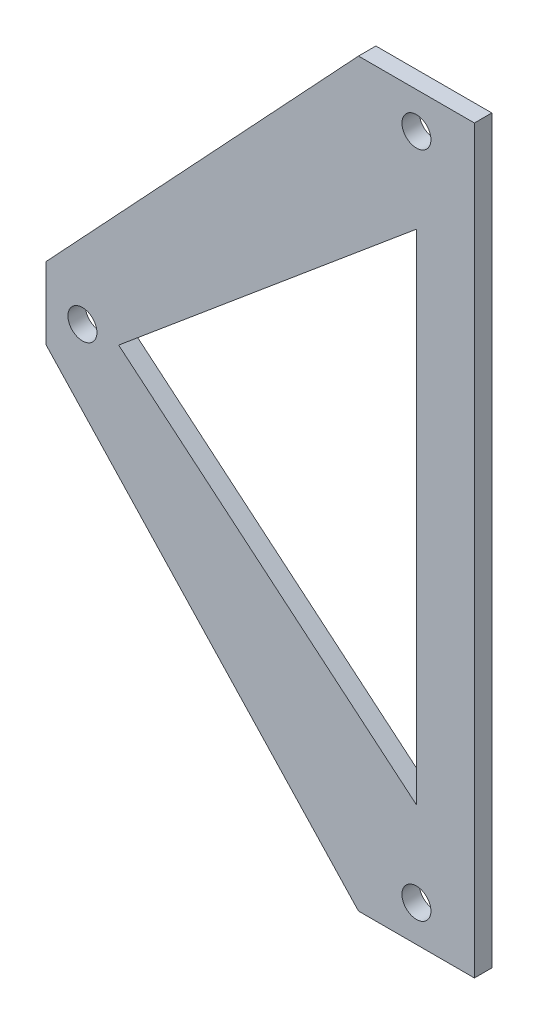
ISO-10303-21;
HEADER;
FILE_DESCRIPTION(('STEP AP214'),'2;1');
FILE_NAME('part.step','',(''),(''),'','','');
FILE_SCHEMA(('AUTOMOTIVE_DESIGN { 1 0 10303 214 1 1 1 1 }'));
ENDSEC;
DATA;
#1=APPLICATION_CONTEXT('core data for automotive mechanical design processes');
#2=APPLICATION_PROTOCOL_DEFINITION('international standard','automotive_design',2000,#1);
#3=PRODUCT_CONTEXT('',#1,'mechanical');
#4=PRODUCT('Part','Part','',(#3));
#5=PRODUCT_RELATED_PRODUCT_CATEGORY('part','',(#4));
#6=PRODUCT_DEFINITION_FORMATION('','',#4);
#7=PRODUCT_DEFINITION_CONTEXT('part definition',#1,'design');
#8=PRODUCT_DEFINITION('design','',#6,#7);
#9=PRODUCT_DEFINITION_SHAPE('','',#8);
#10=(LENGTH_UNIT() NAMED_UNIT(*) SI_UNIT(.MILLI.,.METRE.));
#11=(NAMED_UNIT(*) PLANE_ANGLE_UNIT() SI_UNIT($,.RADIAN.));
#12=(NAMED_UNIT(*) SI_UNIT($,.STERADIAN.) SOLID_ANGLE_UNIT());
#13=UNCERTAINTY_MEASURE_WITH_UNIT(LENGTH_MEASURE(1.E-05),#10,'distance_accuracy_value','');
#14=(GEOMETRIC_REPRESENTATION_CONTEXT(3) GLOBAL_UNCERTAINTY_ASSIGNED_CONTEXT((#13)) GLOBAL_UNIT_ASSIGNED_CONTEXT((#10,
#11,#12)) REPRESENTATION_CONTEXT('',''));
#15=CARTESIAN_POINT('',(0.,0.,0.));
#16=DIRECTION('',(0.,0.,1.));
#17=DIRECTION('',(1.,0.,0.));
#18=AXIS2_PLACEMENT_3D('',#15,#16,#17);
#19=CARTESIAN_POINT('',(0.,0.,1.2));
#20=DIRECTION('',(0.,0.,1.));
#21=DIRECTION('',(1.,0.,0.));
#22=AXIS2_PLACEMENT_3D('',#19,#20,#21);
#23=PLANE('',#22);
#24=DIRECTION('',(0.,1.,0.));
#25=VECTOR('',#24,1.);
#26=CARTESIAN_POINT('',(39.7324296403445,76.6602319223482,1.2));
#27=LINE('',#26,#25);
#28=CARTESIAN_POINT('',(39.7324296403445,76.6602319223482,1.2));
#29=VERTEX_POINT('',#28);
#30=CARTESIAN_POINT('',(39.7324296403445,127.760231922348,1.2));
#31=VERTEX_POINT('',#30);
#32=EDGE_CURVE('E107',#29,#31,#27,.T.);
#33=ORIENTED_EDGE('',*,*,#32,.T.);
#34=DIRECTION('',(-1.,0.,0.));
#35=VECTOR('',#34,1.);
#36=CARTESIAN_POINT('',(39.7324296403445,127.760231922348,1.2));
#37=LINE('',#36,#35);
#38=CARTESIAN_POINT('',(31.7324296403445,127.760231922348,1.2));
#39=VERTEX_POINT('',#38);
#40=EDGE_CURVE('E112',#31,#39,#37,.T.);
#41=ORIENTED_EDGE('',*,*,#40,.T.);
#42=DIRECTION('',(0.682939025488615,0.730475384571349,0.));
#43=VECTOR('',#42,1.);
#44=CARTESIAN_POINT('',(-46.8035225324962,43.7577401551103,1.2));
#45=LINE('',#44,#43);
#46=CARTESIAN_POINT('',(10.1824296403445,104.710231922348,1.2));
#47=VERTEX_POINT('',#46);
#48=EDGE_CURVE('E158',#47,#39,#45,.T.);
#49=ORIENTED_EDGE('',*,*,#48,.F.);
#50=DIRECTION('',(0.,-1.,0.));
#51=VECTOR('',#50,1.);
#52=CARTESIAN_POINT('',(10.1824296403445,0.,1.2));
#53=LINE('',#52,#51);
#54=CARTESIAN_POINT('',(10.1824296403445,99.7102319223483,1.2));
#55=VERTEX_POINT('',#54);
#56=EDGE_CURVE('E160',#47,#55,#53,.T.);
#57=ORIENTED_EDGE('',*,*,#56,.T.);
#58=DIRECTION('',(0.682939025488615,-0.73047538457135,0.));
#59=VECTOR('',#58,1.);
#60=CARTESIAN_POINT('',(55.1757443732806,51.5851319411798,1.2));
#61=LINE('',#60,#59);
#62=CARTESIAN_POINT('',(31.7324296403445,76.6602319223482,1.2));
#63=VERTEX_POINT('',#62);
#64=EDGE_CURVE('E163',#55,#63,#61,.T.);
#65=ORIENTED_EDGE('',*,*,#64,.T.);
#66=DIRECTION('',(1.,0.,0.));
#67=VECTOR('',#66,1.);
#68=CARTESIAN_POINT('',(31.7324296403445,76.6602319223482,1.2));
#69=LINE('',#68,#67);
#70=EDGE_CURVE('E52',#63,#29,#69,.T.);
#71=ORIENTED_EDGE('',*,*,#70,.T.);
#72=EDGE_LOOP('',(#33,#41,#49,#57,#65,#71));
#73=FACE_BOUND('',#72,.T.);
#74=DIRECTION('',(0.766811300603871,-0.641872595821164,0.));
#75=VECTOR('',#74,1.);
#76=CARTESIAN_POINT('',(56.5625489861963,67.5722908813195,1.2));
#77=LINE('',#76,#75);
#78=CARTESIAN_POINT('',(15.1824296403445,102.210231922348,1.2));
#79=VERTEX_POINT('',#78);
#80=CARTESIAN_POINT('',(35.7324296403445,85.0085007614521,1.2));
#81=VERTEX_POINT('',#80);
#82=EDGE_CURVE('E155',#79,#81,#77,.T.);
#83=ORIENTED_EDGE('',*,*,#82,.F.);
#84=DIRECTION('',(0.766811300603872,0.641872595821163,0.));
#85=VECTOR('',#84,1.);
#86=CARTESIAN_POINT('',(-44.0522139279447,52.6268541085665,1.2));
#87=LINE('',#86,#85);
#88=CARTESIAN_POINT('',(35.7324296403445,119.411963083244,1.2));
#89=VERTEX_POINT('',#88);
#90=EDGE_CURVE('E124',#79,#89,#87,.T.);
#91=ORIENTED_EDGE('',*,*,#90,.T.);
#92=DIRECTION('',(0.,-1.,0.));
#93=VECTOR('',#92,1.);
#94=CARTESIAN_POINT('',(35.7324296403445,0.,1.2));
#95=LINE('',#94,#93);
#96=EDGE_CURVE('E152',#89,#81,#95,.T.);
#97=ORIENTED_EDGE('',*,*,#96,.T.);
#98=EDGE_LOOP('',(#83,#91,#97));
#99=FACE_BOUND('',#98,.T.);
#100=CARTESIAN_POINT('',(12.6824296403445,102.210231922348,1.2));
#101=DIRECTION('',(0.,0.,1.));
#102=DIRECTION('',(1.,0.,0.));
#103=AXIS2_PLACEMENT_3D('',#100,#101,#102);
#104=CIRCLE('',#103,0.999999999999998);
#105=CARTESIAN_POINT('',(13.6824296403445,102.210231922348,1.2));
#106=VERTEX_POINT('',#105);
#107=EDGE_CURVE('E165',#106,#106,#104,.T.);
#108=ORIENTED_EDGE('',*,*,#107,.F.);
#109=EDGE_LOOP('',(#108));
#110=FACE_BOUND('',#109,.T.);
#111=CARTESIAN_POINT('',(35.7324296403445,79.1602319223482,1.2));
#112=DIRECTION('',(0.,0.,1.));
#113=DIRECTION('',(1.,0.,0.));
#114=AXIS2_PLACEMENT_3D('',#111,#112,#113);
#115=CIRCLE('',#114,0.999999999999992);
#116=CARTESIAN_POINT('',(36.7324296403445,79.1602319223482,1.2));
#117=VERTEX_POINT('',#116);
#118=EDGE_CURVE('E182',#117,#117,#115,.T.);
#119=ORIENTED_EDGE('',*,*,#118,.F.);
#120=EDGE_LOOP('',(#119));
#121=FACE_BOUND('',#120,.T.);
#122=CARTESIAN_POINT('',(35.7324296403445,125.260231922348,1.2));
#123=DIRECTION('',(0.,0.,1.));
#124=DIRECTION('',(1.,0.,0.));
#125=AXIS2_PLACEMENT_3D('',#122,#123,#124);
#126=CIRCLE('',#125,0.999999999999992);
#127=CARTESIAN_POINT('',(36.7324296403445,125.260231922348,1.2));
#128=VERTEX_POINT('',#127);
#129=EDGE_CURVE('E131',#128,#128,#126,.T.);
#130=ORIENTED_EDGE('',*,*,#129,.F.);
#131=EDGE_LOOP('',(#130));
#132=FACE_BOUND('',#131,.T.);
#133=ADVANCED_FACE('F35',(#73,#99,#110,#121,#132),#23,.T.);
#134=CARTESIAN_POINT('',(0.,0.,0.));
#135=DIRECTION('',(0.,0.,1.));
#136=DIRECTION('',(1.,0.,0.));
#137=AXIS2_PLACEMENT_3D('',#134,#135,#136);
#138=PLANE('',#137);
#139=DIRECTION('',(-0.766811300603872,-0.641872595821163,0.));
#140=VECTOR('',#139,1.);
#141=CARTESIAN_POINT('',(-44.0522139279447,52.6268541085665,0.));
#142=LINE('',#141,#140);
#143=CARTESIAN_POINT('',(35.7324296403445,119.411963083244,0.));
#144=VERTEX_POINT('',#143);
#145=CARTESIAN_POINT('',(15.1824296403445,102.210231922348,0.));
#146=VERTEX_POINT('',#145);
#147=EDGE_CURVE('E143',#144,#146,#142,.T.);
#148=ORIENTED_EDGE('',*,*,#147,.T.);
#149=DIRECTION('',(-0.766811300603871,0.641872595821164,0.));
#150=VECTOR('',#149,1.);
#151=CARTESIAN_POINT('',(56.5625489861963,67.5722908813195,0.));
#152=LINE('',#151,#150);
#153=CARTESIAN_POINT('',(35.7324296403445,85.0085007614521,0.));
#154=VERTEX_POINT('',#153);
#155=EDGE_CURVE('E140',#154,#146,#152,.T.);
#156=ORIENTED_EDGE('',*,*,#155,.F.);
#157=DIRECTION('',(0.,1.,0.));
#158=VECTOR('',#157,1.);
#159=CARTESIAN_POINT('',(35.7324296403445,0.,0.));
#160=LINE('',#159,#158);
#161=EDGE_CURVE('E137',#154,#144,#160,.T.);
#162=ORIENTED_EDGE('',*,*,#161,.T.);
#163=EDGE_LOOP('',(#148,#156,#162));
#164=FACE_BOUND('',#163,.T.);
#165=CARTESIAN_POINT('',(12.6824296403445,102.210231922348,0.));
#166=DIRECTION('',(0.,0.,1.));
#167=DIRECTION('',(1.,0.,0.));
#168=AXIS2_PLACEMENT_3D('',#165,#166,#167);
#169=CIRCLE('',#168,0.999999999999998);
#170=CARTESIAN_POINT('',(13.6824296403445,102.210231922348,0.));
#171=VERTEX_POINT('',#170);
#172=EDGE_CURVE('E147',#171,#171,#169,.F.);
#173=ORIENTED_EDGE('',*,*,#172,.F.);
#174=EDGE_LOOP('',(#173));
#175=FACE_BOUND('',#174,.T.);
#176=DIRECTION('',(0.,1.,0.));
#177=VECTOR('',#176,1.);
#178=CARTESIAN_POINT('',(10.1824296403445,0.,0.));
#179=LINE('',#178,#177);
#180=CARTESIAN_POINT('',(10.1824296403445,99.7102319223483,0.));
#181=VERTEX_POINT('',#180);
#182=CARTESIAN_POINT('',(10.1824296403445,104.710231922348,0.));
#183=VERTEX_POINT('',#182);
#184=EDGE_CURVE('E68',#181,#183,#179,.T.);
#185=ORIENTED_EDGE('',*,*,#184,.T.);
#186=DIRECTION('',(-0.682939025488615,-0.730475384571349,0.));
#187=VECTOR('',#186,1.);
#188=CARTESIAN_POINT('',(-46.8035225324962,43.7577401551103,0.));
#189=LINE('',#188,#187);
#190=CARTESIAN_POINT('',(31.7324296403445,127.760231922348,0.));
#191=VERTEX_POINT('',#190);
#192=EDGE_CURVE('E139',#191,#183,#189,.T.);
#193=ORIENTED_EDGE('',*,*,#192,.F.);
#194=DIRECTION('',(-1.,0.,0.));
#195=VECTOR('',#194,1.);
#196=CARTESIAN_POINT('',(39.7324296403445,127.760231922348,0.));
#197=LINE('',#196,#195);
#198=CARTESIAN_POINT('',(39.7324296403445,127.760231922348,0.));
#199=VERTEX_POINT('',#198);
#200=EDGE_CURVE('E129',#199,#191,#197,.T.);
#201=ORIENTED_EDGE('',*,*,#200,.F.);
#202=DIRECTION('',(0.,1.,0.));
#203=VECTOR('',#202,1.);
#204=CARTESIAN_POINT('',(39.7324296403445,76.6602319223482,0.));
#205=LINE('',#204,#203);
#206=CARTESIAN_POINT('',(39.7324296403445,76.6602319223482,0.));
#207=VERTEX_POINT('',#206);
#208=EDGE_CURVE('E120',#207,#199,#205,.T.);
#209=ORIENTED_EDGE('',*,*,#208,.F.);
#210=DIRECTION('',(1.,0.,0.));
#211=VECTOR('',#210,1.);
#212=CARTESIAN_POINT('',(31.7324296403445,76.6602319223482,0.));
#213=LINE('',#212,#211);
#214=CARTESIAN_POINT('',(31.7324296403445,76.6602319223482,0.));
#215=VERTEX_POINT('',#214);
#216=EDGE_CURVE('E63',#215,#207,#213,.T.);
#217=ORIENTED_EDGE('',*,*,#216,.F.);
#218=DIRECTION('',(-0.682939025488615,0.73047538457135,0.));
#219=VECTOR('',#218,1.);
#220=CARTESIAN_POINT('',(55.1757443732806,51.5851319411798,0.));
#221=LINE('',#220,#219);
#222=EDGE_CURVE('E145',#215,#181,#221,.T.);
#223=ORIENTED_EDGE('',*,*,#222,.T.);
#224=EDGE_LOOP('',(#185,#193,#201,#209,#217,#223));
#225=FACE_BOUND('',#224,.T.);
#226=CARTESIAN_POINT('',(35.7324296403445,79.1602319223482,0.));
#227=DIRECTION('',(0.,0.,1.));
#228=DIRECTION('',(1.,0.,0.));
#229=AXIS2_PLACEMENT_3D('',#226,#227,#228);
#230=CIRCLE('',#229,0.999999999999992);
#231=CARTESIAN_POINT('',(36.7324296403445,79.1602319223482,0.));
#232=VERTEX_POINT('',#231);
#233=EDGE_CURVE('E181',#232,#232,#230,.T.);
#234=ORIENTED_EDGE('',*,*,#233,.T.);
#235=EDGE_LOOP('',(#234));
#236=FACE_BOUND('',#235,.T.);
#237=CARTESIAN_POINT('',(35.7324296403445,125.260231922348,0.));
#238=DIRECTION('',(0.,0.,1.));
#239=DIRECTION('',(1.,0.,0.));
#240=AXIS2_PLACEMENT_3D('',#237,#238,#239);
#241=CIRCLE('',#240,0.999999999999992);
#242=CARTESIAN_POINT('',(36.7324296403445,125.260231922348,0.));
#243=VERTEX_POINT('',#242);
#244=EDGE_CURVE('E134',#243,#243,#241,.T.);
#245=ORIENTED_EDGE('',*,*,#244,.T.);
#246=EDGE_LOOP('',(#245));
#247=FACE_BOUND('',#246,.T.);
#248=ADVANCED_FACE('F190',(#164,#175,#225,#236,#247),#138,.F.);
#249=CARTESIAN_POINT('',(31.7324296403445,76.6602319223482,1.2));
#250=DIRECTION('',(0.,1.,0.));
#251=DIRECTION('',(0.,0.,1.));
#252=AXIS2_PLACEMENT_3D('',#249,#250,#251);
#253=PLANE('',#252);
#254=ORIENTED_EDGE('',*,*,#216,.T.);
#255=DIRECTION('',(0.,0.,-1.));
#256=VECTOR('',#255,1.);
#257=CARTESIAN_POINT('',(39.7324296403445,76.6602319223482,1.2));
#258=LINE('',#257,#256);
#259=EDGE_CURVE('E44',#29,#207,#258,.T.);
#260=ORIENTED_EDGE('',*,*,#259,.F.);
#261=ORIENTED_EDGE('',*,*,#70,.F.);
#262=DIRECTION('',(0.,0.,-1.));
#263=VECTOR('',#262,1.);
#264=CARTESIAN_POINT('',(31.7324296403445,76.6602319223482,1.2));
#265=LINE('',#264,#263);
#266=EDGE_CURVE('E11',#63,#215,#265,.T.);
#267=ORIENTED_EDGE('',*,*,#266,.T.);
#268=EDGE_LOOP('',(#254,#260,#261,#267));
#269=FACE_BOUND('',#268,.T.);
#270=ADVANCED_FACE('F37',(#269),#253,.F.);
#271=CARTESIAN_POINT('',(39.7324296403445,76.6602319223482,1.2));
#272=DIRECTION('',(-1.,0.,0.));
#273=DIRECTION('',(0.,-1.,0.));
#274=AXIS2_PLACEMENT_3D('',#271,#272,#273);
#275=PLANE('',#274);
#276=ORIENTED_EDGE('',*,*,#208,.T.);
#277=DIRECTION('',(0.,0.,-1.));
#278=VECTOR('',#277,1.);
#279=CARTESIAN_POINT('',(39.7324296403445,127.760231922348,1.2));
#280=LINE('',#279,#278);
#281=EDGE_CURVE('E118',#31,#199,#280,.T.);
#282=ORIENTED_EDGE('',*,*,#281,.F.);
#283=ORIENTED_EDGE('',*,*,#32,.F.);
#284=ORIENTED_EDGE('',*,*,#259,.T.);
#285=EDGE_LOOP('',(#276,#282,#283,#284));
#286=FACE_BOUND('',#285,.T.);
#287=ADVANCED_FACE('F119',(#286),#275,.F.);
#288=CARTESIAN_POINT('',(35.7324296403445,79.1602319223482,1.2));
#289=DIRECTION('',(0.,0.,-1.));
#290=DIRECTION('',(-1.,0.,0.));
#291=AXIS2_PLACEMENT_3D('',#288,#289,#290);
#292=CYLINDRICAL_SURFACE('',#291,0.999999999999992);
#293=ORIENTED_EDGE('',*,*,#118,.T.);
#294=EDGE_LOOP('',(#293));
#295=FACE_BOUND('',#294,.T.);
#296=ORIENTED_EDGE('',*,*,#233,.F.);
#297=EDGE_LOOP('',(#296));
#298=FACE_BOUND('',#297,.T.);
#299=ADVANCED_FACE('F209',(#295,#298),#292,.F.);
#300=CARTESIAN_POINT('',(10.1824296403445,0.,-59.0289124073958));
#301=DIRECTION('',(-1.,0.,0.));
#302=DIRECTION('',(0.,0.,1.));
#303=AXIS2_PLACEMENT_3D('',#300,#301,#302);
#304=PLANE('',#303);
#305=ORIENTED_EDGE('',*,*,#184,.F.);
#306=DIRECTION('',(0.,0.,1.));
#307=VECTOR('',#306,1.);
#308=CARTESIAN_POINT('',(10.1824296403445,99.7102319223483,-59.0289124073958));
#309=LINE('',#308,#307);
#310=EDGE_CURVE('E170',#181,#55,#309,.T.);
#311=ORIENTED_EDGE('',*,*,#310,.T.);
#312=ORIENTED_EDGE('',*,*,#56,.F.);
#313=DIRECTION('',(0.,0.,1.));
#314=VECTOR('',#313,1.);
#315=CARTESIAN_POINT('',(10.1824296403445,104.710231922348,-59.0289124073958));
#316=LINE('',#315,#314);
#317=EDGE_CURVE('E172',#183,#47,#316,.T.);
#318=ORIENTED_EDGE('',*,*,#317,.F.);
#319=EDGE_LOOP('',(#305,#311,#312,#318));
#320=FACE_BOUND('',#319,.T.);
#321=ADVANCED_FACE('F197',(#320),#304,.T.);
#322=CARTESIAN_POINT('',(55.1757443732806,51.5851319411798,-59.0289124073958));
#323=DIRECTION('',(-0.73047538457135,-0.682939025488615,0.));
#324=DIRECTION('',(0.682939025488615,-0.73047538457135,0.));
#325=AXIS2_PLACEMENT_3D('',#322,#323,#324);
#326=PLANE('',#325);
#327=ORIENTED_EDGE('',*,*,#222,.F.);
#328=ORIENTED_EDGE('',*,*,#266,.F.);
#329=ORIENTED_EDGE('',*,*,#64,.F.);
#330=ORIENTED_EDGE('',*,*,#310,.F.);
#331=EDGE_LOOP('',(#327,#328,#329,#330));
#332=FACE_BOUND('',#331,.T.);
#333=ADVANCED_FACE('F203',(#332),#326,.T.);
#334=CARTESIAN_POINT('',(-46.8035225324962,43.7577401551103,-59.0289124073958));
#335=DIRECTION('',(0.730475384571349,-0.682939025488615,0.));
#336=DIRECTION('',(0.682939025488615,0.730475384571349,0.));
#337=AXIS2_PLACEMENT_3D('',#334,#335,#336);
#338=PLANE('',#337);
#339=DIRECTION('',(0.,0.,1.));
#340=VECTOR('',#339,1.);
#341=CARTESIAN_POINT('',(31.7324296403445,127.760231922348,-59.0289124073958));
#342=LINE('',#341,#340);
#343=EDGE_CURVE('E128',#191,#39,#342,.T.);
#344=ORIENTED_EDGE('',*,*,#343,.F.);
#345=ORIENTED_EDGE('',*,*,#192,.T.);
#346=ORIENTED_EDGE('',*,*,#317,.T.);
#347=ORIENTED_EDGE('',*,*,#48,.T.);
#348=EDGE_LOOP('',(#344,#345,#346,#347));
#349=FACE_BOUND('',#348,.T.);
#350=ADVANCED_FACE('F194',(#349),#338,.F.);
#351=CARTESIAN_POINT('',(35.7324296403445,0.,-59.0289124073958));
#352=DIRECTION('',(-1.,0.,0.));
#353=DIRECTION('',(0.,-1.,0.));
#354=AXIS2_PLACEMENT_3D('',#351,#352,#353);
#355=PLANE('',#354);
#356=ORIENTED_EDGE('',*,*,#161,.F.);
#357=DIRECTION('',(0.,0.,1.));
#358=VECTOR('',#357,1.);
#359=CARTESIAN_POINT('',(35.7324296403445,85.0085007614521,-59.0289124073958));
#360=LINE('',#359,#358);
#361=EDGE_CURVE('E176',#154,#81,#360,.T.);
#362=ORIENTED_EDGE('',*,*,#361,.T.);
#363=ORIENTED_EDGE('',*,*,#96,.F.);
#364=DIRECTION('',(0.,0.,1.));
#365=VECTOR('',#364,1.);
#366=CARTESIAN_POINT('',(35.7324296403445,119.411963083244,-59.0289124073958));
#367=LINE('',#366,#365);
#368=EDGE_CURVE('E168',#144,#89,#367,.T.);
#369=ORIENTED_EDGE('',*,*,#368,.F.);
#370=EDGE_LOOP('',(#356,#362,#363,#369));
#371=FACE_BOUND('',#370,.T.);
#372=ADVANCED_FACE('F226',(#371),#355,.T.);
#373=CARTESIAN_POINT('',(56.5625489861963,67.5722908813195,-59.0289124073958));
#374=DIRECTION('',(-0.641872595821164,-0.766811300603871,0.));
#375=DIRECTION('',(0.766811300603871,-0.641872595821164,0.));
#376=AXIS2_PLACEMENT_3D('',#373,#374,#375);
#377=PLANE('',#376);
#378=ORIENTED_EDGE('',*,*,#361,.F.);
#379=ORIENTED_EDGE('',*,*,#155,.T.);
#380=DIRECTION('',(0.,0.,1.));
#381=VECTOR('',#380,1.);
#382=CARTESIAN_POINT('',(15.1824296403445,102.210231922348,-59.0289124073958));
#383=LINE('',#382,#381);
#384=EDGE_CURVE('E174',#146,#79,#383,.T.);
#385=ORIENTED_EDGE('',*,*,#384,.T.);
#386=ORIENTED_EDGE('',*,*,#82,.T.);
#387=EDGE_LOOP('',(#378,#379,#385,#386));
#388=FACE_BOUND('',#387,.T.);
#389=ADVANCED_FACE('F224',(#388),#377,.F.);
#390=CARTESIAN_POINT('',(-44.0522139279447,52.6268541085665,-59.0289124073958));
#391=DIRECTION('',(0.641872595821164,-0.766811300603872,0.));
#392=DIRECTION('',(0.766811300603872,0.641872595821163,0.));
#393=AXIS2_PLACEMENT_3D('',#390,#391,#392);
#394=PLANE('',#393);
#395=ORIENTED_EDGE('',*,*,#147,.F.);
#396=ORIENTED_EDGE('',*,*,#368,.T.);
#397=ORIENTED_EDGE('',*,*,#90,.F.);
#398=ORIENTED_EDGE('',*,*,#384,.F.);
#399=EDGE_LOOP('',(#395,#396,#397,#398));
#400=FACE_BOUND('',#399,.T.);
#401=ADVANCED_FACE('F220',(#400),#394,.T.);
#402=CARTESIAN_POINT('',(12.6824296403445,102.210231922348,-59.0289124073958));
#403=DIRECTION('',(0.,0.,1.));
#404=DIRECTION('',(1.,0.,0.));
#405=AXIS2_PLACEMENT_3D('',#402,#403,#404);
#406=CYLINDRICAL_SURFACE('',#405,0.999999999999998);
#407=ORIENTED_EDGE('',*,*,#172,.T.);
#408=EDGE_LOOP('',(#407));
#409=FACE_BOUND('',#408,.T.);
#410=ORIENTED_EDGE('',*,*,#107,.T.);
#411=EDGE_LOOP('',(#410));
#412=FACE_BOUND('',#411,.T.);
#413=ADVANCED_FACE('F223',(#409,#412),#406,.F.);
#414=CARTESIAN_POINT('',(39.7324296403445,127.760231922348,1.2));
#415=DIRECTION('',(0.,-1.,0.));
#416=DIRECTION('',(0.,0.,-1.));
#417=AXIS2_PLACEMENT_3D('',#414,#415,#416);
#418=PLANE('',#417);
#419=ORIENTED_EDGE('',*,*,#200,.T.);
#420=ORIENTED_EDGE('',*,*,#343,.T.);
#421=ORIENTED_EDGE('',*,*,#40,.F.);
#422=ORIENTED_EDGE('',*,*,#281,.T.);
#423=EDGE_LOOP('',(#419,#420,#421,#422));
#424=FACE_BOUND('',#423,.T.);
#425=ADVANCED_FACE('F126',(#424),#418,.F.);
#426=CARTESIAN_POINT('',(35.7324296403445,125.260231922348,1.2));
#427=DIRECTION('',(0.,0.,-1.));
#428=DIRECTION('',(-1.,0.,0.));
#429=AXIS2_PLACEMENT_3D('',#426,#427,#428);
#430=CYLINDRICAL_SURFACE('',#429,0.999999999999992);
#431=ORIENTED_EDGE('',*,*,#129,.T.);
#432=EDGE_LOOP('',(#431));
#433=FACE_BOUND('',#432,.T.);
#434=ORIENTED_EDGE('',*,*,#244,.F.);
#435=EDGE_LOOP('',(#434));
#436=FACE_BOUND('',#435,.T.);
#437=ADVANCED_FACE('F244',(#433,#436),#430,.F.);
#438=CLOSED_SHELL('',(#133,#248,#270,#287,#299,#321,#333,#350,#372,#389,#401,#413,#425,#437));
#439=MANIFOLD_SOLID_BREP('B2',#438);
#440=ADVANCED_BREP_SHAPE_REPRESENTATION('',(#18,#439),#14);
#441=SHAPE_DEFINITION_REPRESENTATION(#9,#440);
ENDSEC;
END-ISO-10303-21;
